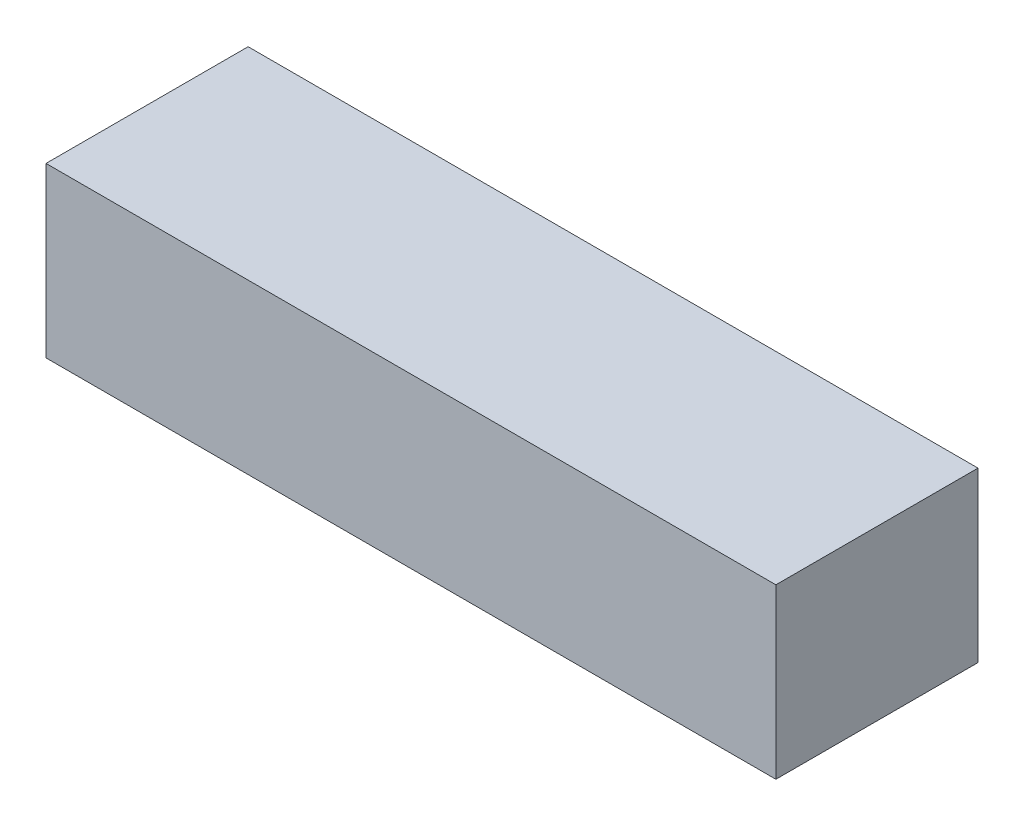
ISO-10303-21;
HEADER;
FILE_DESCRIPTION(('STEP AP214'),'2;1');
FILE_NAME('part.step','',(''),(''),'','','');
FILE_SCHEMA(('AUTOMOTIVE_DESIGN { 1 0 10303 214 1 1 1 1 }'));
ENDSEC;
DATA;
#1=APPLICATION_CONTEXT('core data for automotive mechanical design processes');
#2=APPLICATION_PROTOCOL_DEFINITION('international standard','automotive_design',2000,#1);
#3=PRODUCT_CONTEXT('',#1,'mechanical');
#4=PRODUCT('Part','Part','',(#3));
#5=PRODUCT_RELATED_PRODUCT_CATEGORY('part','',(#4));
#6=PRODUCT_DEFINITION_FORMATION('','',#4);
#7=PRODUCT_DEFINITION_CONTEXT('part definition',#1,'design');
#8=PRODUCT_DEFINITION('design','',#6,#7);
#9=PRODUCT_DEFINITION_SHAPE('','',#8);
#10=(LENGTH_UNIT() NAMED_UNIT(*) SI_UNIT(.MILLI.,.METRE.));
#11=(NAMED_UNIT(*) PLANE_ANGLE_UNIT() SI_UNIT($,.RADIAN.));
#12=(NAMED_UNIT(*) SI_UNIT($,.STERADIAN.) SOLID_ANGLE_UNIT());
#13=UNCERTAINTY_MEASURE_WITH_UNIT(LENGTH_MEASURE(1.E-05),#10,'distance_accuracy_value','');
#14=(GEOMETRIC_REPRESENTATION_CONTEXT(3) GLOBAL_UNCERTAINTY_ASSIGNED_CONTEXT((#13)) GLOBAL_UNIT_ASSIGNED_CONTEXT((#10,
#11,#12)) REPRESENTATION_CONTEXT('',''));
#15=CARTESIAN_POINT('',(0.,0.,0.));
#16=DIRECTION('',(0.,0.,1.));
#17=DIRECTION('',(1.,0.,0.));
#18=AXIS2_PLACEMENT_3D('',#15,#16,#17);
#19=CARTESIAN_POINT('',(0.,0.,-18.));
#20=DIRECTION('',(-1.,0.,0.));
#21=DIRECTION('',(0.,0.,1.));
#22=AXIS2_PLACEMENT_3D('',#19,#20,#21);
#23=PLANE('',#22);
#24=DIRECTION('',(0.,-1.,0.));
#25=VECTOR('',#24,1.);
#26=CARTESIAN_POINT('',(0.,0.,0.));
#27=LINE('',#26,#25);
#28=CARTESIAN_POINT('',(0.,15.,0.));
#29=VERTEX_POINT('',#28);
#30=CARTESIAN_POINT('',(0.,0.,0.));
#31=VERTEX_POINT('',#30);
#32=EDGE_CURVE('E97',#29,#31,#27,.T.);
#33=ORIENTED_EDGE('',*,*,#32,.F.);
#34=DIRECTION('',(0.,0.,1.));
#35=VECTOR('',#34,1.);
#36=CARTESIAN_POINT('',(0.,15.,-18.));
#37=LINE('',#36,#35);
#38=CARTESIAN_POINT('',(0.,15.,-18.));
#39=VERTEX_POINT('',#38);
#40=EDGE_CURVE('E11',#39,#29,#37,.T.);
#41=ORIENTED_EDGE('',*,*,#40,.F.);
#42=DIRECTION('',(0.,-1.,0.));
#43=VECTOR('',#42,1.);
#44=CARTESIAN_POINT('',(0.,0.,-18.));
#45=LINE('',#44,#43);
#46=CARTESIAN_POINT('',(0.,0.,-18.));
#47=VERTEX_POINT('',#46);
#48=EDGE_CURVE('E91',#39,#47,#45,.T.);
#49=ORIENTED_EDGE('',*,*,#48,.T.);
#50=DIRECTION('',(0.,0.,1.));
#51=VECTOR('',#50,1.);
#52=CARTESIAN_POINT('',(0.,0.,-18.));
#53=LINE('',#52,#51);
#54=EDGE_CURVE('E36',#47,#31,#53,.T.);
#55=ORIENTED_EDGE('',*,*,#54,.T.);
#56=EDGE_LOOP('',(#33,#41,#49,#55));
#57=FACE_BOUND('',#56,.T.);
#58=ADVANCED_FACE('F33',(#57),#23,.T.);
#59=CARTESIAN_POINT('',(0.,15.,-18.));
#60=DIRECTION('',(0.,1.,0.));
#61=DIRECTION('',(0.,0.,1.));
#62=AXIS2_PLACEMENT_3D('',#59,#60,#61);
#63=PLANE('',#62);
#64=DIRECTION('',(-1.,0.,0.));
#65=VECTOR('',#64,1.);
#66=CARTESIAN_POINT('',(0.,15.,0.));
#67=LINE('',#66,#65);
#68=CARTESIAN_POINT('',(65.,15.,0.));
#69=VERTEX_POINT('',#68);
#70=EDGE_CURVE('E93',#69,#29,#67,.T.);
#71=ORIENTED_EDGE('',*,*,#70,.F.);
#72=DIRECTION('',(0.,0.,1.));
#73=VECTOR('',#72,1.);
#74=CARTESIAN_POINT('',(65.,15.,-18.));
#75=LINE('',#74,#73);
#76=CARTESIAN_POINT('',(65.,15.,-18.));
#77=VERTEX_POINT('',#76);
#78=EDGE_CURVE('E42',#77,#69,#75,.T.);
#79=ORIENTED_EDGE('',*,*,#78,.F.);
#80=DIRECTION('',(-1.,0.,0.));
#81=VECTOR('',#80,1.);
#82=CARTESIAN_POINT('',(0.,15.,-18.));
#83=LINE('',#82,#81);
#84=EDGE_CURVE('E88',#77,#39,#83,.T.);
#85=ORIENTED_EDGE('',*,*,#84,.T.);
#86=ORIENTED_EDGE('',*,*,#40,.T.);
#87=EDGE_LOOP('',(#71,#79,#85,#86));
#88=FACE_BOUND('',#87,.T.);
#89=ADVANCED_FACE('F107',(#88),#63,.T.);
#90=CARTESIAN_POINT('',(65.,0.,-18.));
#91=DIRECTION('',(1.,0.,0.));
#92=DIRECTION('',(0.,0.,-1.));
#93=AXIS2_PLACEMENT_3D('',#90,#91,#92);
#94=PLANE('',#93);
#95=DIRECTION('',(0.,1.,0.));
#96=VECTOR('',#95,1.);
#97=CARTESIAN_POINT('',(65.,0.,0.));
#98=LINE('',#97,#96);
#99=CARTESIAN_POINT('',(65.,0.,0.));
#100=VERTEX_POINT('',#99);
#101=EDGE_CURVE('E83',#100,#69,#98,.T.);
#102=ORIENTED_EDGE('',*,*,#101,.F.);
#103=DIRECTION('',(0.,0.,1.));
#104=VECTOR('',#103,1.);
#105=CARTESIAN_POINT('',(65.,0.,-18.));
#106=LINE('',#105,#104);
#107=CARTESIAN_POINT('',(65.,0.,-18.));
#108=VERTEX_POINT('',#107);
#109=EDGE_CURVE('E78',#108,#100,#106,.T.);
#110=ORIENTED_EDGE('',*,*,#109,.F.);
#111=DIRECTION('',(0.,1.,0.));
#112=VECTOR('',#111,1.);
#113=CARTESIAN_POINT('',(65.,0.,-18.));
#114=LINE('',#113,#112);
#115=EDGE_CURVE('E81',#108,#77,#114,.T.);
#116=ORIENTED_EDGE('',*,*,#115,.T.);
#117=ORIENTED_EDGE('',*,*,#78,.T.);
#118=EDGE_LOOP('',(#102,#110,#116,#117));
#119=FACE_BOUND('',#118,.T.);
#120=ADVANCED_FACE('F80',(#119),#94,.T.);
#121=CARTESIAN_POINT('',(0.,0.,-18.));
#122=DIRECTION('',(0.,-1.,0.));
#123=DIRECTION('',(0.,0.,-1.));
#124=AXIS2_PLACEMENT_3D('',#121,#122,#123);
#125=PLANE('',#124);
#126=DIRECTION('',(1.,0.,0.));
#127=VECTOR('',#126,1.);
#128=CARTESIAN_POINT('',(0.,0.,0.));
#129=LINE('',#128,#127);
#130=EDGE_CURVE('E100',#31,#100,#129,.T.);
#131=ORIENTED_EDGE('',*,*,#130,.F.);
#132=ORIENTED_EDGE('',*,*,#54,.F.);
#133=DIRECTION('',(1.,0.,0.));
#134=VECTOR('',#133,1.);
#135=CARTESIAN_POINT('',(0.,0.,-18.));
#136=LINE('',#135,#134);
#137=EDGE_CURVE('E87',#47,#108,#136,.T.);
#138=ORIENTED_EDGE('',*,*,#137,.T.);
#139=ORIENTED_EDGE('',*,*,#109,.T.);
#140=EDGE_LOOP('',(#131,#132,#138,#139));
#141=FACE_BOUND('',#140,.T.);
#142=ADVANCED_FACE('F90',(#141),#125,.T.);
#143=CARTESIAN_POINT('',(0.,0.,-18.));
#144=DIRECTION('',(0.,0.,-1.));
#145=DIRECTION('',(-1.,0.,0.));
#146=AXIS2_PLACEMENT_3D('',#143,#144,#145);
#147=PLANE('',#146);
#148=ORIENTED_EDGE('',*,*,#48,.F.);
#149=ORIENTED_EDGE('',*,*,#84,.F.);
#150=ORIENTED_EDGE('',*,*,#115,.F.);
#151=ORIENTED_EDGE('',*,*,#137,.F.);
#152=EDGE_LOOP('',(#148,#149,#150,#151));
#153=FACE_BOUND('',#152,.T.);
#154=ADVANCED_FACE('F86',(#153),#147,.T.);
#155=CARTESIAN_POINT('',(0.,0.,0.));
#156=DIRECTION('',(0.,0.,-1.));
#157=DIRECTION('',(-1.,0.,0.));
#158=AXIS2_PLACEMENT_3D('',#155,#156,#157);
#159=PLANE('',#158);
#160=ORIENTED_EDGE('',*,*,#32,.T.);
#161=ORIENTED_EDGE('',*,*,#130,.T.);
#162=ORIENTED_EDGE('',*,*,#101,.T.);
#163=ORIENTED_EDGE('',*,*,#70,.T.);
#164=EDGE_LOOP('',(#160,#161,#162,#163));
#165=FACE_BOUND('',#164,.T.);
#166=ADVANCED_FACE('F106',(#165),#159,.F.);
#167=CLOSED_SHELL('',(#58,#89,#120,#142,#154,#166));
#168=MANIFOLD_SOLID_BREP('B2',#167);
#169=ADVANCED_BREP_SHAPE_REPRESENTATION('',(#18,#168),#14);
#170=SHAPE_DEFINITION_REPRESENTATION(#9,#169);
ENDSEC;
END-ISO-10303-21;
